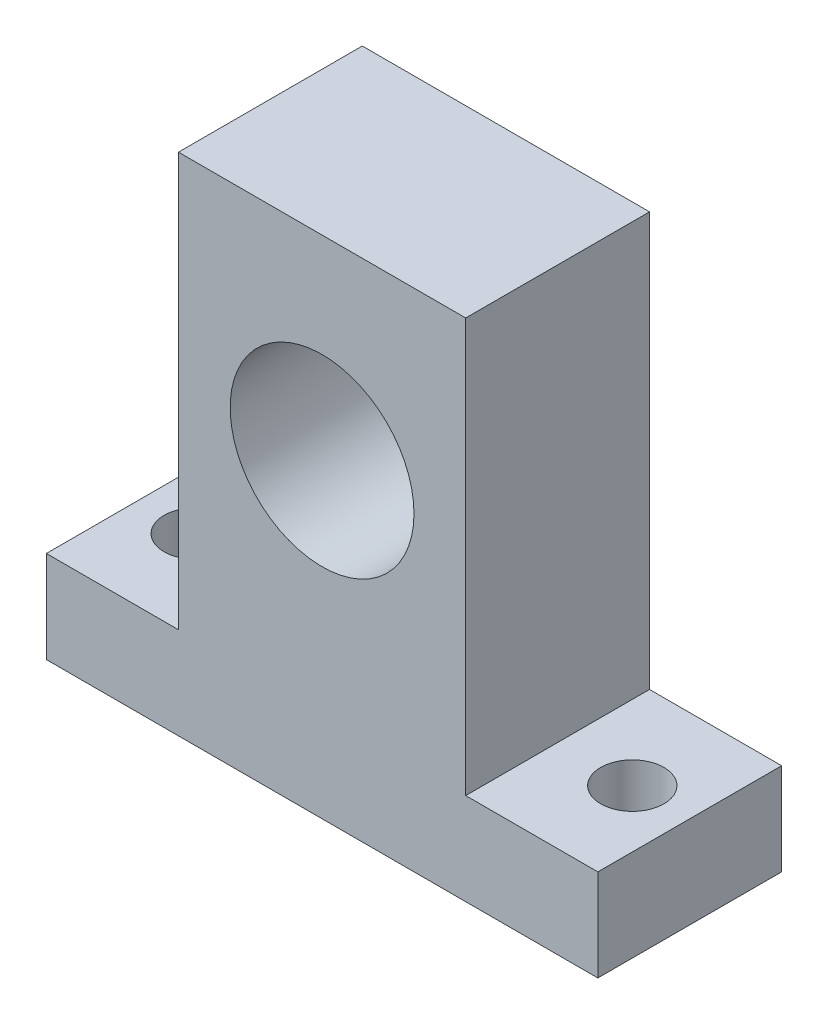
ISO-10303-21;
HEADER;
FILE_DESCRIPTION(('STEP AP214'),'2;1');
FILE_NAME('part.step','',(''),(''),'','','');
FILE_SCHEMA(('AUTOMOTIVE_DESIGN { 1 0 10303 214 1 1 1 1 }'));
ENDSEC;
DATA;
#1=APPLICATION_CONTEXT('core data for automotive mechanical design processes');
#2=APPLICATION_PROTOCOL_DEFINITION('international standard','automotive_design',2000,#1);
#3=PRODUCT_CONTEXT('',#1,'mechanical');
#4=PRODUCT('Part','Part','',(#3));
#5=PRODUCT_RELATED_PRODUCT_CATEGORY('part','',(#4));
#6=PRODUCT_DEFINITION_FORMATION('','',#4);
#7=PRODUCT_DEFINITION_CONTEXT('part definition',#1,'design');
#8=PRODUCT_DEFINITION('design','',#6,#7);
#9=PRODUCT_DEFINITION_SHAPE('','',#8);
#10=(LENGTH_UNIT() NAMED_UNIT(*) SI_UNIT(.MILLI.,.METRE.));
#11=(NAMED_UNIT(*) PLANE_ANGLE_UNIT() SI_UNIT($,.RADIAN.));
#12=(NAMED_UNIT(*) SI_UNIT($,.STERADIAN.) SOLID_ANGLE_UNIT());
#13=UNCERTAINTY_MEASURE_WITH_UNIT(LENGTH_MEASURE(1.E-05),#10,'distance_accuracy_value','');
#14=(GEOMETRIC_REPRESENTATION_CONTEXT(3) GLOBAL_UNCERTAINTY_ASSIGNED_CONTEXT((#13)) GLOBAL_UNIT_ASSIGNED_CONTEXT((#10,
#11,#12)) REPRESENTATION_CONTEXT('',''));
#15=CARTESIAN_POINT('',(0.,0.,0.));
#16=DIRECTION('',(0.,0.,1.));
#17=DIRECTION('',(1.,0.,0.));
#18=AXIS2_PLACEMENT_3D('',#15,#16,#17);
#19=CARTESIAN_POINT('',(-12.5,44.,8.));
#20=DIRECTION('',(0.,0.,1.));
#21=DIRECTION('',(1.,0.,0.));
#22=AXIS2_PLACEMENT_3D('',#19,#20,#21);
#23=PLANE('',#22);
#24=DIRECTION('',(0.,-1.,0.));
#25=VECTOR('',#24,1.);
#26=CARTESIAN_POINT('',(-12.5,8.,8.));
#27=LINE('',#26,#25);
#28=CARTESIAN_POINT('',(-12.5,44.,8.));
#29=VERTEX_POINT('',#28);
#30=CARTESIAN_POINT('',(-12.5,8.,8.));
#31=VERTEX_POINT('',#30);
#32=EDGE_CURVE('E149',#29,#31,#27,.T.);
#33=ORIENTED_EDGE('',*,*,#32,.T.);
#34=DIRECTION('',(-1.,0.,0.));
#35=VECTOR('',#34,1.);
#36=CARTESIAN_POINT('',(-24.,8.,8.));
#37=LINE('',#36,#35);
#38=CARTESIAN_POINT('',(-24.,8.,8.));
#39=VERTEX_POINT('',#38);
#40=EDGE_CURVE('E97',#31,#39,#37,.T.);
#41=ORIENTED_EDGE('',*,*,#40,.T.);
#42=DIRECTION('',(0.,-1.,0.));
#43=VECTOR('',#42,1.);
#44=CARTESIAN_POINT('',(-24.,0.,8.));
#45=LINE('',#44,#43);
#46=CARTESIAN_POINT('',(-24.,0.,8.));
#47=VERTEX_POINT('',#46);
#48=EDGE_CURVE('E164',#39,#47,#45,.T.);
#49=ORIENTED_EDGE('',*,*,#48,.T.);
#50=DIRECTION('',(1.,0.,0.));
#51=VECTOR('',#50,1.);
#52=CARTESIAN_POINT('',(-24.,0.,8.));
#53=LINE('',#52,#51);
#54=CARTESIAN_POINT('',(24.,0.,8.));
#55=VERTEX_POINT('',#54);
#56=EDGE_CURVE('E177',#47,#55,#53,.T.);
#57=ORIENTED_EDGE('',*,*,#56,.T.);
#58=DIRECTION('',(0.,1.,0.));
#59=VECTOR('',#58,1.);
#60=CARTESIAN_POINT('',(24.,0.,8.));
#61=LINE('',#60,#59);
#62=CARTESIAN_POINT('',(24.,8.,8.));
#63=VERTEX_POINT('',#62);
#64=EDGE_CURVE('E116',#55,#63,#61,.T.);
#65=ORIENTED_EDGE('',*,*,#64,.T.);
#66=DIRECTION('',(-1.,0.,0.));
#67=VECTOR('',#66,1.);
#68=CARTESIAN_POINT('',(24.,8.,8.));
#69=LINE('',#68,#67);
#70=CARTESIAN_POINT('',(12.5,8.,8.));
#71=VERTEX_POINT('',#70);
#72=EDGE_CURVE('E110',#63,#71,#69,.T.);
#73=ORIENTED_EDGE('',*,*,#72,.T.);
#74=DIRECTION('',(0.,1.,0.));
#75=VECTOR('',#74,1.);
#76=CARTESIAN_POINT('',(12.5,8.,8.));
#77=LINE('',#76,#75);
#78=CARTESIAN_POINT('',(12.5,44.,8.));
#79=VERTEX_POINT('',#78);
#80=EDGE_CURVE('E114',#71,#79,#77,.T.);
#81=ORIENTED_EDGE('',*,*,#80,.T.);
#82=DIRECTION('',(-1.,0.,0.));
#83=VECTOR('',#82,1.);
#84=CARTESIAN_POINT('',(12.5,44.,8.));
#85=LINE('',#84,#83);
#86=EDGE_CURVE('E54',#79,#29,#85,.T.);
#87=ORIENTED_EDGE('',*,*,#86,.T.);
#88=EDGE_LOOP('',(#33,#41,#49,#57,#65,#73,#81,#87));
#89=FACE_BOUND('',#88,.T.);
#90=CARTESIAN_POINT('',(0.,27.,8.));
#91=DIRECTION('',(0.,0.,1.));
#92=DIRECTION('',(1.,0.,0.));
#93=AXIS2_PLACEMENT_3D('',#90,#91,#92);
#94=CIRCLE('',#93,8.);
#95=CARTESIAN_POINT('',(8.,27.,8.));
#96=VERTEX_POINT('',#95);
#97=EDGE_CURVE('E138',#96,#96,#94,.T.);
#98=ORIENTED_EDGE('',*,*,#97,.F.);
#99=EDGE_LOOP('',(#98));
#100=FACE_BOUND('',#99,.T.);
#101=ADVANCED_FACE('F37',(#89,#100),#23,.T.);
#102=CARTESIAN_POINT('',(-12.5,44.,-8.));
#103=DIRECTION('',(0.,0.,1.));
#104=DIRECTION('',(1.,0.,0.));
#105=AXIS2_PLACEMENT_3D('',#102,#103,#104);
#106=PLANE('',#105);
#107=DIRECTION('',(0.,-1.,0.));
#108=VECTOR('',#107,1.);
#109=CARTESIAN_POINT('',(-12.5,8.,-8.));
#110=LINE('',#109,#108);
#111=CARTESIAN_POINT('',(-12.5,44.,-8.));
#112=VERTEX_POINT('',#111);
#113=CARTESIAN_POINT('',(-12.5,8.,-8.));
#114=VERTEX_POINT('',#113);
#115=EDGE_CURVE('E134',#112,#114,#110,.T.);
#116=ORIENTED_EDGE('',*,*,#115,.F.);
#117=DIRECTION('',(-1.,0.,0.));
#118=VECTOR('',#117,1.);
#119=CARTESIAN_POINT('',(12.5,44.,-8.));
#120=LINE('',#119,#118);
#121=CARTESIAN_POINT('',(12.5,44.,-8.));
#122=VERTEX_POINT('',#121);
#123=EDGE_CURVE('E89',#122,#112,#120,.T.);
#124=ORIENTED_EDGE('',*,*,#123,.F.);
#125=DIRECTION('',(0.,1.,0.));
#126=VECTOR('',#125,1.);
#127=CARTESIAN_POINT('',(12.5,8.,-8.));
#128=LINE('',#127,#126);
#129=CARTESIAN_POINT('',(12.5,8.,-8.));
#130=VERTEX_POINT('',#129);
#131=EDGE_CURVE('E83',#130,#122,#128,.T.);
#132=ORIENTED_EDGE('',*,*,#131,.F.);
#133=DIRECTION('',(-1.,0.,0.));
#134=VECTOR('',#133,1.);
#135=CARTESIAN_POINT('',(24.,8.,-8.));
#136=LINE('',#135,#134);
#137=CARTESIAN_POINT('',(24.,8.,-8.));
#138=VERTEX_POINT('',#137);
#139=EDGE_CURVE('E124',#138,#130,#136,.T.);
#140=ORIENTED_EDGE('',*,*,#139,.F.);
#141=DIRECTION('',(0.,1.,0.));
#142=VECTOR('',#141,1.);
#143=CARTESIAN_POINT('',(24.,0.,-8.));
#144=LINE('',#143,#142);
#145=CARTESIAN_POINT('',(24.,0.,-8.));
#146=VERTEX_POINT('',#145);
#147=EDGE_CURVE('E144',#146,#138,#144,.T.);
#148=ORIENTED_EDGE('',*,*,#147,.F.);
#149=DIRECTION('',(1.,0.,0.));
#150=VECTOR('',#149,1.);
#151=CARTESIAN_POINT('',(-24.,0.,-8.));
#152=LINE('',#151,#150);
#153=CARTESIAN_POINT('',(-24.,0.,-8.));
#154=VERTEX_POINT('',#153);
#155=EDGE_CURVE('E142',#154,#146,#152,.T.);
#156=ORIENTED_EDGE('',*,*,#155,.F.);
#157=DIRECTION('',(0.,-1.,0.));
#158=VECTOR('',#157,1.);
#159=CARTESIAN_POINT('',(-24.,0.,-8.));
#160=LINE('',#159,#158);
#161=CARTESIAN_POINT('',(-24.,8.,-8.));
#162=VERTEX_POINT('',#161);
#163=EDGE_CURVE('E140',#162,#154,#160,.T.);
#164=ORIENTED_EDGE('',*,*,#163,.F.);
#165=DIRECTION('',(-1.,0.,0.));
#166=VECTOR('',#165,1.);
#167=CARTESIAN_POINT('',(-24.,8.,-8.));
#168=LINE('',#167,#166);
#169=EDGE_CURVE('E137',#114,#162,#168,.T.);
#170=ORIENTED_EDGE('',*,*,#169,.F.);
#171=EDGE_LOOP('',(#116,#124,#132,#140,#148,#156,#164,#170));
#172=FACE_BOUND('',#171,.T.);
#173=CARTESIAN_POINT('',(0.,27.,-8.));
#174=DIRECTION('',(0.,0.,1.));
#175=DIRECTION('',(1.,0.,0.));
#176=AXIS2_PLACEMENT_3D('',#173,#174,#175);
#177=CIRCLE('',#176,8.);
#178=CARTESIAN_POINT('',(8.,27.,-8.));
#179=VERTEX_POINT('',#178);
#180=EDGE_CURVE('E183',#179,#179,#177,.T.);
#181=ORIENTED_EDGE('',*,*,#180,.T.);
#182=EDGE_LOOP('',(#181));
#183=FACE_BOUND('',#182,.T.);
#184=ADVANCED_FACE('F168',(#172,#183),#106,.F.);
#185=CARTESIAN_POINT('',(-12.5,8.,8.));
#186=DIRECTION('',(1.,0.,0.));
#187=DIRECTION('',(0.,1.,0.));
#188=AXIS2_PLACEMENT_3D('',#185,#186,#187);
#189=PLANE('',#188);
#190=ORIENTED_EDGE('',*,*,#115,.T.);
#191=DIRECTION('',(0.,0.,-1.));
#192=VECTOR('',#191,1.);
#193=CARTESIAN_POINT('',(-12.5,8.,8.));
#194=LINE('',#193,#192);
#195=EDGE_CURVE('E11',#31,#114,#194,.T.);
#196=ORIENTED_EDGE('',*,*,#195,.F.);
#197=ORIENTED_EDGE('',*,*,#32,.F.);
#198=DIRECTION('',(0.,0.,-1.));
#199=VECTOR('',#198,1.);
#200=CARTESIAN_POINT('',(-12.5,44.,8.));
#201=LINE('',#200,#199);
#202=EDGE_CURVE('E130',#29,#112,#201,.T.);
#203=ORIENTED_EDGE('',*,*,#202,.T.);
#204=EDGE_LOOP('',(#190,#196,#197,#203));
#205=FACE_BOUND('',#204,.T.);
#206=ADVANCED_FACE('F39',(#205),#189,.F.);
#207=CARTESIAN_POINT('',(-24.,8.,8.));
#208=DIRECTION('',(0.,-1.,0.));
#209=DIRECTION('',(1.,0.,0.));
#210=AXIS2_PLACEMENT_3D('',#207,#208,#209);
#211=PLANE('',#210);
#212=CARTESIAN_POINT('',(-19.,8.,0.));
#213=DIRECTION('',(0.,1.,0.));
#214=DIRECTION('',(0.,0.,-1.));
#215=AXIS2_PLACEMENT_3D('',#212,#213,#214);
#216=CIRCLE('',#215,2.75);
#217=CARTESIAN_POINT('',(-19.,8.,-2.74999999999999));
#218=VERTEX_POINT('',#217);
#219=EDGE_CURVE('E195',#218,#218,#216,.T.);
#220=ORIENTED_EDGE('',*,*,#219,.F.);
#221=EDGE_LOOP('',(#220));
#222=FACE_BOUND('',#221,.T.);
#223=ORIENTED_EDGE('',*,*,#169,.T.);
#224=DIRECTION('',(0.,0.,-1.));
#225=VECTOR('',#224,1.);
#226=CARTESIAN_POINT('',(-24.,8.,8.));
#227=LINE('',#226,#225);
#228=EDGE_CURVE('E46',#39,#162,#227,.T.);
#229=ORIENTED_EDGE('',*,*,#228,.F.);
#230=ORIENTED_EDGE('',*,*,#40,.F.);
#231=ORIENTED_EDGE('',*,*,#195,.T.);
#232=EDGE_LOOP('',(#223,#229,#230,#231));
#233=FACE_BOUND('',#232,.T.);
#234=ADVANCED_FACE('F210',(#222,#233),#211,.F.);
#235=CARTESIAN_POINT('',(-24.,0.,8.));
#236=DIRECTION('',(1.,0.,0.));
#237=DIRECTION('',(0.,1.,0.));
#238=AXIS2_PLACEMENT_3D('',#235,#236,#237);
#239=PLANE('',#238);
#240=ORIENTED_EDGE('',*,*,#163,.T.);
#241=DIRECTION('',(0.,0.,-1.));
#242=VECTOR('',#241,1.);
#243=CARTESIAN_POINT('',(-24.,0.,8.));
#244=LINE('',#243,#242);
#245=EDGE_CURVE('E156',#47,#154,#244,.T.);
#246=ORIENTED_EDGE('',*,*,#245,.F.);
#247=ORIENTED_EDGE('',*,*,#48,.F.);
#248=ORIENTED_EDGE('',*,*,#228,.T.);
#249=EDGE_LOOP('',(#240,#246,#247,#248));
#250=FACE_BOUND('',#249,.T.);
#251=ADVANCED_FACE('F162',(#250),#239,.F.);
#252=CARTESIAN_POINT('',(-24.,0.,8.));
#253=DIRECTION('',(0.,1.,0.));
#254=DIRECTION('',(-1.,0.,0.));
#255=AXIS2_PLACEMENT_3D('',#252,#253,#254);
#256=PLANE('',#255);
#257=CARTESIAN_POINT('',(-19.,0.,0.));
#258=DIRECTION('',(0.,1.,0.));
#259=DIRECTION('',(0.,0.,-1.));
#260=AXIS2_PLACEMENT_3D('',#257,#258,#259);
#261=CIRCLE('',#260,2.75);
#262=CARTESIAN_POINT('',(-19.,0.,-2.74999999999999));
#263=VERTEX_POINT('',#262);
#264=EDGE_CURVE('E192',#263,#263,#261,.T.);
#265=ORIENTED_EDGE('',*,*,#264,.T.);
#266=EDGE_LOOP('',(#265));
#267=FACE_BOUND('',#266,.T.);
#268=CARTESIAN_POINT('',(19.,0.,0.));
#269=DIRECTION('',(0.,1.,0.));
#270=DIRECTION('',(0.,0.,1.));
#271=AXIS2_PLACEMENT_3D('',#268,#269,#270);
#272=CIRCLE('',#271,2.75);
#273=CARTESIAN_POINT('',(19.,0.,2.75));
#274=VERTEX_POINT('',#273);
#275=EDGE_CURVE('E186',#274,#274,#272,.T.);
#276=ORIENTED_EDGE('',*,*,#275,.T.);
#277=EDGE_LOOP('',(#276));
#278=FACE_BOUND('',#277,.T.);
#279=ORIENTED_EDGE('',*,*,#155,.T.);
#280=DIRECTION('',(0.,0.,-1.));
#281=VECTOR('',#280,1.);
#282=CARTESIAN_POINT('',(24.,0.,8.));
#283=LINE('',#282,#281);
#284=EDGE_CURVE('E153',#55,#146,#283,.T.);
#285=ORIENTED_EDGE('',*,*,#284,.F.);
#286=ORIENTED_EDGE('',*,*,#56,.F.);
#287=ORIENTED_EDGE('',*,*,#245,.T.);
#288=EDGE_LOOP('',(#279,#285,#286,#287));
#289=FACE_BOUND('',#288,.T.);
#290=ADVANCED_FACE('F173',(#267,#278,#289),#256,.F.);
#291=CARTESIAN_POINT('',(24.,0.,8.));
#292=DIRECTION('',(-1.,0.,0.));
#293=DIRECTION('',(0.,0.,1.));
#294=AXIS2_PLACEMENT_3D('',#291,#292,#293);
#295=PLANE('',#294);
#296=ORIENTED_EDGE('',*,*,#147,.T.);
#297=DIRECTION('',(0.,0.,-1.));
#298=VECTOR('',#297,1.);
#299=CARTESIAN_POINT('',(24.,8.,8.));
#300=LINE('',#299,#298);
#301=EDGE_CURVE('E125',#63,#138,#300,.T.);
#302=ORIENTED_EDGE('',*,*,#301,.F.);
#303=ORIENTED_EDGE('',*,*,#64,.F.);
#304=ORIENTED_EDGE('',*,*,#284,.T.);
#305=EDGE_LOOP('',(#296,#302,#303,#304));
#306=FACE_BOUND('',#305,.T.);
#307=ADVANCED_FACE('F176',(#306),#295,.F.);
#308=CARTESIAN_POINT('',(24.,8.,8.));
#309=DIRECTION('',(0.,-1.,0.));
#310=DIRECTION('',(0.,0.,-1.));
#311=AXIS2_PLACEMENT_3D('',#308,#309,#310);
#312=PLANE('',#311);
#313=CARTESIAN_POINT('',(19.,8.,0.));
#314=DIRECTION('',(0.,1.,0.));
#315=DIRECTION('',(0.,0.,1.));
#316=AXIS2_PLACEMENT_3D('',#313,#314,#315);
#317=CIRCLE('',#316,2.75);
#318=CARTESIAN_POINT('',(19.,8.,2.75));
#319=VERTEX_POINT('',#318);
#320=EDGE_CURVE('E189',#319,#319,#317,.T.);
#321=ORIENTED_EDGE('',*,*,#320,.F.);
#322=EDGE_LOOP('',(#321));
#323=FACE_BOUND('',#322,.T.);
#324=ORIENTED_EDGE('',*,*,#139,.T.);
#325=DIRECTION('',(0.,0.,-1.));
#326=VECTOR('',#325,1.);
#327=CARTESIAN_POINT('',(12.5,8.,8.));
#328=LINE('',#327,#326);
#329=EDGE_CURVE('E121',#71,#130,#328,.T.);
#330=ORIENTED_EDGE('',*,*,#329,.F.);
#331=ORIENTED_EDGE('',*,*,#72,.F.);
#332=ORIENTED_EDGE('',*,*,#301,.T.);
#333=EDGE_LOOP('',(#324,#330,#331,#332));
#334=FACE_BOUND('',#333,.T.);
#335=ADVANCED_FACE('F122',(#323,#334),#312,.F.);
#336=CARTESIAN_POINT('',(12.5,8.,8.));
#337=DIRECTION('',(-1.,0.,0.));
#338=DIRECTION('',(0.,-1.,0.));
#339=AXIS2_PLACEMENT_3D('',#336,#337,#338);
#340=PLANE('',#339);
#341=ORIENTED_EDGE('',*,*,#131,.T.);
#342=DIRECTION('',(0.,0.,-1.));
#343=VECTOR('',#342,1.);
#344=CARTESIAN_POINT('',(12.5,44.,8.));
#345=LINE('',#344,#343);
#346=EDGE_CURVE('E126',#79,#122,#345,.T.);
#347=ORIENTED_EDGE('',*,*,#346,.F.);
#348=ORIENTED_EDGE('',*,*,#80,.F.);
#349=ORIENTED_EDGE('',*,*,#329,.T.);
#350=EDGE_LOOP('',(#341,#347,#348,#349));
#351=FACE_BOUND('',#350,.T.);
#352=ADVANCED_FACE('F128',(#351),#340,.F.);
#353=CARTESIAN_POINT('',(12.5,44.,8.));
#354=DIRECTION('',(0.,-1.,0.));
#355=DIRECTION('',(0.,0.,-1.));
#356=AXIS2_PLACEMENT_3D('',#353,#354,#355);
#357=PLANE('',#356);
#358=ORIENTED_EDGE('',*,*,#123,.T.);
#359=ORIENTED_EDGE('',*,*,#202,.F.);
#360=ORIENTED_EDGE('',*,*,#86,.F.);
#361=ORIENTED_EDGE('',*,*,#346,.T.);
#362=EDGE_LOOP('',(#358,#359,#360,#361));
#363=FACE_BOUND('',#362,.T.);
#364=ADVANCED_FACE('F215',(#363),#357,.F.);
#365=CARTESIAN_POINT('',(0.,27.,8.));
#366=DIRECTION('',(0.,0.,-1.));
#367=DIRECTION('',(-1.,0.,0.));
#368=AXIS2_PLACEMENT_3D('',#365,#366,#367);
#369=CYLINDRICAL_SURFACE('',#368,8.);
#370=ORIENTED_EDGE('',*,*,#97,.T.);
#371=EDGE_LOOP('',(#370));
#372=FACE_BOUND('',#371,.T.);
#373=ORIENTED_EDGE('',*,*,#180,.F.);
#374=EDGE_LOOP('',(#373));
#375=FACE_BOUND('',#374,.T.);
#376=ADVANCED_FACE('F217',(#372,#375),#369,.F.);
#377=CARTESIAN_POINT('',(19.,0.,0.));
#378=DIRECTION('',(0.,1.,0.));
#379=DIRECTION('',(0.,0.,1.));
#380=AXIS2_PLACEMENT_3D('',#377,#378,#379);
#381=CYLINDRICAL_SURFACE('',#380,2.75);
#382=ORIENTED_EDGE('',*,*,#275,.F.);
#383=EDGE_LOOP('',(#382));
#384=FACE_BOUND('',#383,.T.);
#385=ORIENTED_EDGE('',*,*,#320,.T.);
#386=EDGE_LOOP('',(#385));
#387=FACE_BOUND('',#386,.T.);
#388=ADVANCED_FACE('F206',(#384,#387),#381,.F.);
#389=CARTESIAN_POINT('',(-19.,0.,0.));
#390=DIRECTION('',(0.,1.,0.));
#391=DIRECTION('',(0.,0.,1.));
#392=AXIS2_PLACEMENT_3D('',#389,#390,#391);
#393=CYLINDRICAL_SURFACE('',#392,2.75);
#394=ORIENTED_EDGE('',*,*,#264,.F.);
#395=EDGE_LOOP('',(#394));
#396=FACE_BOUND('',#395,.T.);
#397=ORIENTED_EDGE('',*,*,#219,.T.);
#398=EDGE_LOOP('',(#397));
#399=FACE_BOUND('',#398,.T.);
#400=ADVANCED_FACE('F203',(#396,#399),#393,.F.);
#401=CLOSED_SHELL('',(#101,#184,#206,#234,#251,#290,#307,#335,#352,#364,#376,#388,#400));
#402=MANIFOLD_SOLID_BREP('B2',#401);
#403=ADVANCED_BREP_SHAPE_REPRESENTATION('',(#18,#402),#14);
#404=SHAPE_DEFINITION_REPRESENTATION(#9,#403);
ENDSEC;
END-ISO-10303-21;
